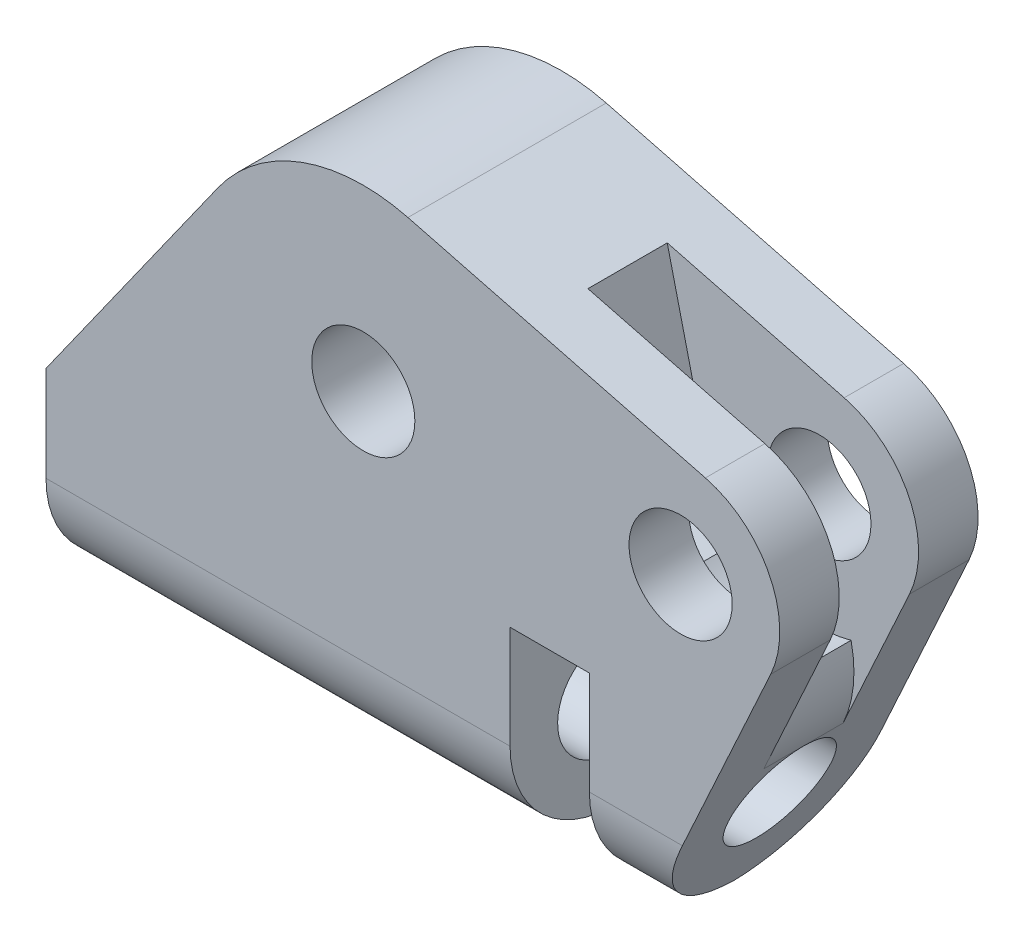
ISO-10303-21;
HEADER;
FILE_DESCRIPTION(('STEP AP214'),'2;1');
FILE_NAME('part.step','',(''),(''),'','','');
FILE_SCHEMA(('AUTOMOTIVE_DESIGN { 1 0 10303 214 1 1 1 1 }'));
ENDSEC;
DATA;
#1=APPLICATION_CONTEXT('core data for automotive mechanical design processes');
#2=APPLICATION_PROTOCOL_DEFINITION('international standard','automotive_design',2000,#1);
#3=PRODUCT_CONTEXT('',#1,'mechanical');
#4=PRODUCT('Part','Part','',(#3));
#5=PRODUCT_RELATED_PRODUCT_CATEGORY('part','',(#4));
#6=PRODUCT_DEFINITION_FORMATION('','',#4);
#7=PRODUCT_DEFINITION_CONTEXT('part definition',#1,'design');
#8=PRODUCT_DEFINITION('design','',#6,#7);
#9=PRODUCT_DEFINITION_SHAPE('','',#8);
#10=(LENGTH_UNIT() NAMED_UNIT(*) SI_UNIT(.MILLI.,.METRE.));
#11=(NAMED_UNIT(*) PLANE_ANGLE_UNIT() SI_UNIT($,.RADIAN.));
#12=(NAMED_UNIT(*) SI_UNIT($,.STERADIAN.) SOLID_ANGLE_UNIT());
#13=UNCERTAINTY_MEASURE_WITH_UNIT(LENGTH_MEASURE(1.E-05),#10,'distance_accuracy_value','');
#14=(GEOMETRIC_REPRESENTATION_CONTEXT(3) GLOBAL_UNCERTAINTY_ASSIGNED_CONTEXT((#13)) GLOBAL_UNIT_ASSIGNED_CONTEXT((#10,
#11,#12)) REPRESENTATION_CONTEXT('',''));
#15=CARTESIAN_POINT('',(0.,0.,0.));
#16=DIRECTION('',(0.,0.,1.));
#17=DIRECTION('',(1.,0.,0.));
#18=AXIS2_PLACEMENT_3D('',#15,#16,#17);
#19=CARTESIAN_POINT('',(474.949704240036,-853.401384058362,-5.));
#20=DIRECTION('',(0.,0.,1.));
#21=DIRECTION('',(1.,0.,0.));
#22=AXIS2_PLACEMENT_3D('',#19,#20,#21);
#23=CYLINDRICAL_SURFACE('',#22,14.5);
#24=DIRECTION('',(0.,0.,1.));
#25=VECTOR('',#24,1.);
#26=CARTESIAN_POINT('',(464.709579504658,-863.667339708173,-5.));
#27=LINE('',#26,#25);
#28=CARTESIAN_POINT('',(464.709579504658,-863.667339708173,5.));
#29=VERTEX_POINT('',#28);
#30=CARTESIAN_POINT('',(464.709579504658,-863.667339708173,-5.));
#31=VERTEX_POINT('',#30);
#32=EDGE_CURVE('E181',#29,#31,#27,.F.);
#33=ORIENTED_EDGE('',*,*,#32,.F.);
#34=CARTESIAN_POINT('',(474.949704240036,-853.401384058362,5.));
#35=DIRECTION('',(0.,0.,1.));
#36=DIRECTION('',(1.,0.,0.));
#37=AXIS2_PLACEMENT_3D('',#34,#35,#36);
#38=CIRCLE('',#37,14.5);
#39=CARTESIAN_POINT('',(478.939828975415,-867.341574322348,5.));
#40=VERTEX_POINT('',#39);
#41=EDGE_CURVE('E211',#29,#40,#38,.T.);
#42=ORIENTED_EDGE('',*,*,#41,.T.);
#43=DIRECTION('',(0.,0.,1.));
#44=VECTOR('',#43,1.);
#45=CARTESIAN_POINT('',(478.939828975415,-867.341574322348,-5.));
#46=LINE('',#45,#44);
#47=CARTESIAN_POINT('',(478.939828975415,-867.341574322348,-5.));
#48=VERTEX_POINT('',#47);
#49=EDGE_CURVE('E202',#48,#40,#46,.T.);
#50=ORIENTED_EDGE('',*,*,#49,.F.);
#51=CARTESIAN_POINT('',(474.949704240036,-853.401384058362,-5.));
#52=DIRECTION('',(0.,0.,1.));
#53=DIRECTION('',(1.,0.,0.));
#54=AXIS2_PLACEMENT_3D('',#51,#52,#53);
#55=CIRCLE('',#54,14.5);
#56=EDGE_CURVE('E214',#31,#48,#55,.T.);
#57=ORIENTED_EDGE('',*,*,#56,.F.);
#58=EDGE_LOOP('',(#33,#42,#50,#57));
#59=FACE_BOUND('',#58,.T.);
#60=ADVANCED_FACE('F32',(#59),#23,.F.);
#61=CARTESIAN_POINT('',(474.949704240036,-883.401384058363,12.5));
#62=DIRECTION('',(-0.909059342886311,0.416666666666664,0.));
#63=DIRECTION('',(-0.416666666666664,-0.909059342886311,0.));
#64=AXIS2_PLACEMENT_3D('',#61,#62,#63);
#65=PLANE('',#64);
#66=CARTESIAN_POINT('',(474.949704240036,-883.401384058363,0.));
#67=DIRECTION('',(-0.909059342886311,0.416666666666664,0.));
#68=DIRECTION('',(-0.416666666666664,-0.909059342886311,0.));
#69=AXIS2_PLACEMENT_3D('',#66,#67,#68);
#70=ELLIPSE('',#69,7.15024827682006,6.50000000000001);
#71=CARTESIAN_POINT('',(471.970434124695,-889.901384058363,0.));
#72=VERTEX_POINT('',#71);
#73=EDGE_CURVE('E272',#72,#72,#70,.T.);
#74=ORIENTED_EDGE('',*,*,#73,.T.);
#75=EDGE_LOOP('',(#74));
#76=FACE_BOUND('',#75,.T.);
#77=DIRECTION('',(0.416666666666664,0.909059342886311,0.));
#78=VECTOR('',#77,1.);
#79=CARTESIAN_POINT('',(474.949704240036,-883.401384058363,-5.));
#80=LINE('',#79,#78);
#81=CARTESIAN_POINT('',(477.940010491954,-876.877306051008,-5.));
#82=VERTEX_POINT('',#81);
#83=CARTESIAN_POINT('',(486.312946026115,-858.609717391696,-5.));
#84=VERTEX_POINT('',#83);
#85=EDGE_CURVE('E47',#82,#84,#80,.T.);
#86=ORIENTED_EDGE('',*,*,#85,.F.);
#87=DIRECTION('',(0.,0.,1.));
#88=VECTOR('',#87,1.);
#89=CARTESIAN_POINT('',(477.940010491954,-876.877306051008,12.5));
#90=LINE('',#89,#88);
#91=CARTESIAN_POINT('',(477.940010491954,-876.877306051008,5.));
#92=VERTEX_POINT('',#91);
#93=EDGE_CURVE('E358',#82,#92,#90,.T.);
#94=ORIENTED_EDGE('',*,*,#93,.T.);
#95=DIRECTION('',(0.416666666666664,0.909059342886311,0.));
#96=VECTOR('',#95,1.);
#97=CARTESIAN_POINT('',(474.949704240036,-883.401384058363,5.));
#98=LINE('',#97,#96);
#99=CARTESIAN_POINT('',(486.312946026115,-858.609717391696,5.));
#100=VERTEX_POINT('',#99);
#101=EDGE_CURVE('E54',#92,#100,#98,.T.);
#102=ORIENTED_EDGE('',*,*,#101,.T.);
#103=DIRECTION('',(0.,0.,-1.));
#104=VECTOR('',#103,1.);
#105=CARTESIAN_POINT('',(486.312946026115,-858.609717391696,12.5));
#106=LINE('',#105,#104);
#107=CARTESIAN_POINT('',(486.312946026115,-858.609717391696,12.5));
#108=VERTEX_POINT('',#107);
#109=EDGE_CURVE('E312',#108,#100,#106,.T.);
#110=ORIENTED_EDGE('',*,*,#109,.F.);
#111=DIRECTION('',(0.416666666666666,0.90905934288631,0.));
#112=VECTOR('',#111,1.);
#113=CARTESIAN_POINT('',(469.22033863361,-895.901384058363,12.5));
#114=LINE('',#113,#112);
#115=CARTESIAN_POINT('',(475.178878864293,-882.901384058363,12.5));
#116=VERTEX_POINT('',#115);
#117=EDGE_CURVE('E287',#116,#108,#114,.T.);
#118=ORIENTED_EDGE('',*,*,#117,.F.);
#119=CARTESIAN_POINT('',(475.178878864293,-882.901384058363,-0.499999999999999));
#120=DIRECTION('',(-0.909059342886311,0.416666666666664,0.));
#121=DIRECTION('',(-0.416666666666664,-0.909059342886311,0.));
#122=AXIS2_PLACEMENT_3D('',#119,#120,#121);
#123=ELLIPSE('',#122,14.3004965536401,13.);
#124=CARTESIAN_POINT('',(469.224747469012,-895.891765115129,-7.18251413206472E-12));
#125=VERTEX_POINT('',#124);
#126=EDGE_CURVE('E331',#116,#125,#123,.F.);
#127=ORIENTED_EDGE('',*,*,#126,.T.);
#128=CARTESIAN_POINT('',(475.178878864293,-882.901384058363,0.499999999999999));
#129=DIRECTION('',(-0.909059342886311,0.416666666666664,0.));
#130=DIRECTION('',(0.416666666666664,0.909059342886311,0.));
#131=AXIS2_PLACEMENT_3D('',#128,#129,#130);
#132=ELLIPSE('',#131,14.3004965536401,13.);
#133=CARTESIAN_POINT('',(475.178878864293,-882.901384058363,-12.5));
#134=VERTEX_POINT('',#133);
#135=EDGE_CURVE('E337',#125,#134,#132,.F.);
#136=ORIENTED_EDGE('',*,*,#135,.T.);
#137=DIRECTION('',(0.416666666666664,0.909059342886311,0.));
#138=VECTOR('',#137,1.);
#139=CARTESIAN_POINT('',(474.949704240036,-883.401384058363,-12.5));
#140=LINE('',#139,#138);
#141=CARTESIAN_POINT('',(486.312946026115,-858.609717391696,-12.5));
#142=VERTEX_POINT('',#141);
#143=EDGE_CURVE('E298',#134,#142,#140,.T.);
#144=ORIENTED_EDGE('',*,*,#143,.T.);
#145=EDGE_CURVE('E311',#84,#142,#106,.T.);
#146=ORIENTED_EDGE('',*,*,#145,.F.);
#147=EDGE_LOOP('',(#86,#94,#102,#110,#118,#127,#136,#144,#146));
#148=FACE_BOUND('',#147,.T.);
#149=ADVANCED_FACE('F364',(#76,#148),#65,.F.);
#150=CARTESIAN_POINT('',(474.949704240036,-853.401384058362,12.5));
#151=DIRECTION('',(0.,0.,-1.));
#152=DIRECTION('',(-1.,0.,0.));
#153=AXIS2_PLACEMENT_3D('',#150,#151,#152);
#154=CYLINDRICAL_SURFACE('',#153,12.5);
#155=CARTESIAN_POINT('',(474.949704240036,-853.401384058362,-5.));
#156=DIRECTION('',(0.,0.,1.));
#157=DIRECTION('',(1.,0.,0.));
#158=AXIS2_PLACEMENT_3D('',#155,#156,#157);
#159=CIRCLE('',#158,12.5);
#160=CARTESIAN_POINT('',(478.074704240036,-841.298311101464,-5.));
#161=VERTEX_POINT('',#160);
#162=EDGE_CURVE('E234',#84,#161,#159,.T.);
#163=ORIENTED_EDGE('',*,*,#162,.F.);
#164=ORIENTED_EDGE('',*,*,#145,.T.);
#165=CARTESIAN_POINT('',(474.949704240036,-853.401384058362,-12.5));
#166=DIRECTION('',(0.,0.,1.));
#167=DIRECTION('',(1.,0.,0.));
#168=AXIS2_PLACEMENT_3D('',#165,#166,#167);
#169=CIRCLE('',#168,12.5);
#170=CARTESIAN_POINT('',(478.074704240036,-841.298311101464,-12.5));
#171=VERTEX_POINT('',#170);
#172=EDGE_CURVE('E301',#142,#171,#169,.T.);
#173=ORIENTED_EDGE('',*,*,#172,.T.);
#174=DIRECTION('',(0.,0.,-1.));
#175=VECTOR('',#174,1.);
#176=CARTESIAN_POINT('',(478.074704240036,-841.298311101464,12.5));
#177=LINE('',#176,#175);
#178=EDGE_CURVE('E307',#161,#171,#177,.T.);
#179=ORIENTED_EDGE('',*,*,#178,.F.);
#180=EDGE_LOOP('',(#163,#164,#173,#179));
#181=FACE_BOUND('',#180,.T.);
#182=ADVANCED_FACE('F399',(#181),#154,.T.);
#183=CARTESIAN_POINT('',(440.574704240036,-831.615852735946,12.5));
#184=DIRECTION('',(-0.249999999999999,-0.968245836551854,0.));
#185=DIRECTION('',(0.968245836551854,-0.249999999999999,0.));
#186=AXIS2_PLACEMENT_3D('',#183,#184,#185);
#187=PLANE('',#186);
#188=DIRECTION('',(-0.968245836551853,0.250000000000004,0.));
#189=VECTOR('',#188,1.);
#190=CARTESIAN_POINT('',(470.959579504657,-839.461193794377,-5.));
#191=LINE('',#190,#189);
#192=CARTESIAN_POINT('',(455.767141872347,-835.538523265161,-5.));
#193=VERTEX_POINT('',#192);
#194=EDGE_CURVE('E216',#161,#193,#191,.T.);
#195=ORIENTED_EDGE('',*,*,#194,.F.);
#196=ORIENTED_EDGE('',*,*,#178,.T.);
#197=DIRECTION('',(-0.968245836551854,0.249999999999999,0.));
#198=VECTOR('',#197,1.);
#199=CARTESIAN_POINT('',(440.574704240036,-831.615852735946,-12.5));
#200=LINE('',#199,#198);
#201=CARTESIAN_POINT('',(440.574704240036,-831.615852735946,-12.5));
#202=VERTEX_POINT('',#201);
#203=EDGE_CURVE('E284',#171,#202,#200,.T.);
#204=ORIENTED_EDGE('',*,*,#203,.T.);
#205=DIRECTION('',(0.,0.,-1.));
#206=VECTOR('',#205,1.);
#207=CARTESIAN_POINT('',(440.574704240036,-831.615852735946,12.5));
#208=LINE('',#207,#206);
#209=CARTESIAN_POINT('',(440.574704240036,-831.615852735946,12.5));
#210=VERTEX_POINT('',#209);
#211=EDGE_CURVE('E293',#210,#202,#208,.T.);
#212=ORIENTED_EDGE('',*,*,#211,.F.);
#213=DIRECTION('',(-0.968245836551854,0.249999999999999,0.));
#214=VECTOR('',#213,1.);
#215=CARTESIAN_POINT('',(440.574704240036,-831.615852735946,12.5));
#216=LINE('',#215,#214);
#217=CARTESIAN_POINT('',(478.074704240036,-841.298311101464,12.5));
#218=VERTEX_POINT('',#217);
#219=EDGE_CURVE('E291',#218,#210,#216,.T.);
#220=ORIENTED_EDGE('',*,*,#219,.F.);
#221=CARTESIAN_POINT('',(478.074704240036,-841.298311101464,5.));
#222=VERTEX_POINT('',#221);
#223=EDGE_CURVE('E308',#218,#222,#177,.T.);
#224=ORIENTED_EDGE('',*,*,#223,.T.);
#225=DIRECTION('',(-0.968245836551854,0.249999999999999,0.));
#226=VECTOR('',#225,1.);
#227=CARTESIAN_POINT('',(440.574704240036,-831.615852735946,5.));
#228=LINE('',#227,#226);
#229=CARTESIAN_POINT('',(455.767141872347,-835.538523265161,5.));
#230=VERTEX_POINT('',#229);
#231=EDGE_CURVE('E227',#222,#230,#228,.T.);
#232=ORIENTED_EDGE('',*,*,#231,.T.);
#233=DIRECTION('',(0.,0.,1.));
#234=VECTOR('',#233,1.);
#235=CARTESIAN_POINT('',(455.767141872347,-835.538523265161,-5.));
#236=LINE('',#235,#234);
#237=EDGE_CURVE('E220',#193,#230,#236,.T.);
#238=ORIENTED_EDGE('',*,*,#237,.F.);
#239=EDGE_LOOP('',(#195,#196,#204,#212,#220,#224,#232,#238));
#240=FACE_BOUND('',#239,.T.);
#241=ADVANCED_FACE('F403',(#240),#187,.F.);
#242=CARTESIAN_POINT('',(474.949704240036,-853.401384058362,12.5));
#243=DIRECTION('',(0.,0.,-1.));
#244=DIRECTION('',(-1.,0.,0.));
#245=AXIS2_PLACEMENT_3D('',#242,#243,#244);
#246=CYLINDRICAL_SURFACE('',#245,6.50000000000002);
#247=CARTESIAN_POINT('',(474.949704240036,-853.401384058362,-12.5));
#248=DIRECTION('',(0.,0.,1.));
#249=DIRECTION('',(1.,0.,0.));
#250=AXIS2_PLACEMENT_3D('',#247,#248,#249);
#251=CIRCLE('',#250,6.50000000000002);
#252=CARTESIAN_POINT('',(481.449704240036,-853.401384058362,-12.5));
#253=VERTEX_POINT('',#252);
#254=EDGE_CURVE('E278',#253,#253,#251,.T.);
#255=ORIENTED_EDGE('',*,*,#254,.F.);
#256=EDGE_LOOP('',(#255));
#257=FACE_BOUND('',#256,.T.);
#258=CARTESIAN_POINT('',(474.949704240036,-853.401384058362,-5.));
#259=DIRECTION('',(0.,0.,1.));
#260=DIRECTION('',(1.,0.,0.));
#261=AXIS2_PLACEMENT_3D('',#258,#259,#260);
#262=CIRCLE('',#261,6.50000000000002);
#263=CARTESIAN_POINT('',(481.449704240036,-853.401384058362,-5.));
#264=VERTEX_POINT('',#263);
#265=EDGE_CURVE('E208',#264,#264,#262,.T.);
#266=ORIENTED_EDGE('',*,*,#265,.T.);
#267=EDGE_LOOP('',(#266));
#268=FACE_BOUND('',#267,.T.);
#269=ADVANCED_FACE('F442',(#257,#268),#246,.F.);
#270=CARTESIAN_POINT('',(487.449704240036,-883.401384058363,0.));
#271=DIRECTION('',(-1.,0.,0.));
#272=DIRECTION('',(0.,-1.,0.));
#273=AXIS2_PLACEMENT_3D('',#270,#271,#272);
#274=CYLINDRICAL_SURFACE('',#273,6.50000000000001);
#275=CARTESIAN_POINT('',(453.449704240036,-883.401384058363,0.));
#276=DIRECTION('',(-1.,0.,0.));
#277=DIRECTION('',(0.,0.,1.));
#278=AXIS2_PLACEMENT_3D('',#275,#276,#277);
#279=CIRCLE('',#278,6.50000000000001);
#280=CARTESIAN_POINT('',(453.449704240036,-889.901384058363,0.));
#281=VERTEX_POINT('',#280);
#282=EDGE_CURVE('E265',#281,#281,#279,.F.);
#283=CARTESIAN_POINT('',(394.949704240037,-883.401384058363,0.));
#284=DIRECTION('',(-1.,0.,0.));
#285=DIRECTION('',(0.,-1.,0.));
#286=AXIS2_PLACEMENT_3D('',#283,#284,#285);
#287=CIRCLE('',#286,6.50000000000001);
#288=CARTESIAN_POINT('',(394.949704240037,-889.901384058363,0.));
#289=VERTEX_POINT('',#288);
#290=EDGE_CURVE('E269',#289,#289,#287,.T.);
#291=CARTESIAN_POINT('',(453.449704240036,-889.901384058363,0.));
#292=CARTESIAN_POINT('',(452.840329240036,-889.901384058363,0.));
#293=CARTESIAN_POINT('',(452.230954240036,-889.901384058363,0.));
#294=CARTESIAN_POINT('',(451.012204240036,-889.901384058363,0.));
#295=CARTESIAN_POINT('',(450.402829240036,-889.901384058363,0.));
#296=CARTESIAN_POINT('',(449.184079240036,-889.901384058363,0.));
#297=CARTESIAN_POINT('',(448.574704240036,-889.901384058363,0.));
#298=CARTESIAN_POINT('',(447.355954240036,-889.901384058363,0.));
#299=CARTESIAN_POINT('',(446.746579240036,-889.901384058363,0.));
#300=CARTESIAN_POINT('',(445.527829240036,-889.901384058363,0.));
#301=CARTESIAN_POINT('',(444.918454240036,-889.901384058363,0.));
#302=CARTESIAN_POINT('',(443.699704240036,-889.901384058363,0.));
#303=CARTESIAN_POINT('',(443.090329240036,-889.901384058363,0.));
#304=CARTESIAN_POINT('',(441.871579240036,-889.901384058363,0.));
#305=CARTESIAN_POINT('',(441.262204240036,-889.901384058363,0.));
#306=CARTESIAN_POINT('',(440.043454240036,-889.901384058363,0.));
#307=CARTESIAN_POINT('',(439.434079240036,-889.901384058363,0.));
#308=CARTESIAN_POINT('',(438.215329240036,-889.901384058363,0.));
#309=CARTESIAN_POINT('',(437.605954240036,-889.901384058363,0.));
#310=CARTESIAN_POINT('',(436.387204240036,-889.901384058363,0.));
#311=CARTESIAN_POINT('',(435.777829240036,-889.901384058363,0.));
#312=CARTESIAN_POINT('',(434.559079240036,-889.901384058363,0.));
#313=CARTESIAN_POINT('',(433.949704240036,-889.901384058363,0.));
#314=CARTESIAN_POINT('',(432.730954240036,-889.901384058363,0.));
#315=CARTESIAN_POINT('',(432.121579240036,-889.901384058363,0.));
#316=CARTESIAN_POINT('',(430.902829240036,-889.901384058363,0.));
#317=CARTESIAN_POINT('',(430.293454240036,-889.901384058363,0.));
#318=CARTESIAN_POINT('',(429.074704240036,-889.901384058363,0.));
#319=CARTESIAN_POINT('',(428.465329240036,-889.901384058363,0.));
#320=CARTESIAN_POINT('',(427.246579240036,-889.901384058363,0.));
#321=CARTESIAN_POINT('',(426.637204240036,-889.901384058363,0.));
#322=CARTESIAN_POINT('',(425.418454240036,-889.901384058363,0.));
#323=CARTESIAN_POINT('',(424.809079240036,-889.901384058363,0.));
#324=CARTESIAN_POINT('',(423.590329240036,-889.901384058363,0.));
#325=CARTESIAN_POINT('',(422.980954240036,-889.901384058363,0.));
#326=CARTESIAN_POINT('',(421.762204240036,-889.901384058363,0.));
#327=CARTESIAN_POINT('',(421.152829240036,-889.901384058363,0.));
#328=CARTESIAN_POINT('',(419.934079240036,-889.901384058363,0.));
#329=CARTESIAN_POINT('',(419.324704240036,-889.901384058363,0.));
#330=CARTESIAN_POINT('',(418.105954240036,-889.901384058363,0.));
#331=CARTESIAN_POINT('',(417.496579240036,-889.901384058363,0.));
#332=CARTESIAN_POINT('',(416.277829240036,-889.901384058363,0.));
#333=CARTESIAN_POINT('',(415.668454240036,-889.901384058363,0.));
#334=CARTESIAN_POINT('',(414.449704240036,-889.901384058363,0.));
#335=CARTESIAN_POINT('',(413.840329240036,-889.901384058363,0.));
#336=CARTESIAN_POINT('',(412.621579240036,-889.901384058363,0.));
#337=CARTESIAN_POINT('',(412.012204240036,-889.901384058363,0.));
#338=CARTESIAN_POINT('',(410.793454240036,-889.901384058363,0.));
#339=CARTESIAN_POINT('',(410.184079240036,-889.901384058363,0.));
#340=CARTESIAN_POINT('',(408.965329240036,-889.901384058363,0.));
#341=CARTESIAN_POINT('',(408.355954240036,-889.901384058363,0.));
#342=CARTESIAN_POINT('',(407.137204240036,-889.901384058363,0.));
#343=CARTESIAN_POINT('',(406.527829240037,-889.901384058363,0.));
#344=CARTESIAN_POINT('',(405.309079240037,-889.901384058363,0.));
#345=CARTESIAN_POINT('',(404.699704240037,-889.901384058363,0.));
#346=CARTESIAN_POINT('',(403.480954240037,-889.901384058363,0.));
#347=CARTESIAN_POINT('',(402.871579240037,-889.901384058363,0.));
#348=CARTESIAN_POINT('',(401.652829240036,-889.901384058363,0.));
#349=CARTESIAN_POINT('',(401.043454240037,-889.901384058363,0.));
#350=CARTESIAN_POINT('',(399.824704240037,-889.901384058363,0.));
#351=CARTESIAN_POINT('',(399.215329240037,-889.901384058363,0.));
#352=CARTESIAN_POINT('',(397.996579240037,-889.901384058363,0.));
#353=CARTESIAN_POINT('',(397.387204240037,-889.901384058363,0.));
#354=CARTESIAN_POINT('',(396.168454240037,-889.901384058363,0.));
#355=CARTESIAN_POINT('',(395.559079240037,-889.901384058363,0.));
#356=CARTESIAN_POINT('',(394.949704240037,-889.901384058363,0.));
#357=B_SPLINE_CURVE_WITH_KNOTS('',3,(#291,#292,#293,#294,#295,#296,#297,#298,#299,#300,#301,
#302,#303,#304,#305,#306,#307,#308,#309,#310,#311,#312,#313,#314,#315,#316,#317,#318,#319,#320,
#321,#322,#323,#324,#325,#326,#327,#328,#329,#330,#331,#332,#333,#334,#335,#336,#337,#338,#339,
#340,#341,#342,#343,#344,#345,#346,#347,#348,#349,#350,#351,#352,#353,#354,#355,#356),
.UNSPECIFIED.,.F.,.F.,(4,2,2,2,2,2,2,2,2,2,2,2,2,2,2,2,2,2,2,2,2,2,2,2,2,2,2,2,2,2,2,2,4),(0.,
1.82812500000001,3.65624999999997,5.48437499999999,7.3125,9.14062499999996,10.96875,
12.7968749999999,14.6249999999999,16.4531249999999,18.2812499999999,20.1093749999999,
21.9374999999999,23.7656249999999,25.5937499999999,27.4218749999999,29.2499999999998,
31.0781249999998,32.9062499999998,34.7343749999998,36.5624999999998,38.3906249999998,
40.2187499999998,42.0468749999998,43.8749999999998,45.7031249999997,47.5312499999997,
49.3593749999997,51.1874999999997,53.0156249999997,54.8437499999997,56.6718749999997,
58.4999999999997),.UNSPECIFIED.);
#358=EDGE_CURVE('BSEAM438',#281,#289,#357,.T.);
#359=ORIENTED_EDGE('',*,*,#282,.T.);
#360=ORIENTED_EDGE('',*,*,#290,.T.);
#361=ORIENTED_EDGE('',*,*,#358,.T.);
#362=ORIENTED_EDGE('',*,*,#358,.F.);
#363=EDGE_LOOP('',(#359,#361,#360,#362));
#364=FACE_BOUND('',#363,.T.);
#365=ADVANCED_FACE('F438',(#364),#274,.F.);
#366=CARTESIAN_POINT('',(434.949704240036,-882.901384058363,-0.499999999999999));
#367=DIRECTION('',(-1.,0.,0.));
#368=DIRECTION('',(0.,0.,1.));
#369=AXIS2_PLACEMENT_3D('',#366,#367,#368);
#370=CYLINDRICAL_SURFACE('',#369,13.);
#371=CARTESIAN_POINT('',(453.449704240036,-882.901384058363,-0.499999999999999));
#372=DIRECTION('',(-1.,0.,0.));
#373=DIRECTION('',(0.,0.,1.));
#374=AXIS2_PLACEMENT_3D('',#371,#372,#373);
#375=CIRCLE('',#374,13.);
#376=CARTESIAN_POINT('',(453.449704240036,-882.901384058363,12.5));
#377=VERTEX_POINT('',#376);
#378=CARTESIAN_POINT('',(453.449704240036,-895.891765115129,-1.25420507313123E-12));
#379=VERTEX_POINT('',#378);
#380=EDGE_CURVE('E263',#377,#379,#375,.F.);
#381=ORIENTED_EDGE('',*,*,#380,.F.);
#382=DIRECTION('',(1.,0.,0.));
#383=VECTOR('',#382,1.);
#384=CARTESIAN_POINT('',(469.22033863361,-882.901384058363,12.5));
#385=LINE('',#384,#383);
#386=CARTESIAN_POINT('',(394.949704240036,-882.901384058363,12.5));
#387=VERTEX_POINT('',#386);
#388=EDGE_CURVE('E349',#387,#377,#385,.T.);
#389=ORIENTED_EDGE('',*,*,#388,.F.);
#390=CARTESIAN_POINT('',(394.949704240036,-882.901384058363,-0.499999999999999));
#391=DIRECTION('',(1.,0.,0.));
#392=DIRECTION('',(0.,0.,-1.));
#393=AXIS2_PLACEMENT_3D('',#390,#391,#392);
#394=CIRCLE('',#393,13.);
#395=CARTESIAN_POINT('',(394.949704240036,-895.891765115129,0.));
#396=VERTEX_POINT('',#395);
#397=EDGE_CURVE('E343',#396,#387,#394,.F.);
#398=ORIENTED_EDGE('',*,*,#397,.F.);
#399=DIRECTION('',(-1.,0.,0.));
#400=VECTOR('',#399,1.);
#401=CARTESIAN_POINT('',(435.304979076038,-895.891765115129,0.));
#402=LINE('',#401,#400);
#403=EDGE_CURVE('E268',#379,#396,#402,.T.);
#404=ORIENTED_EDGE('',*,*,#403,.F.);
#405=EDGE_LOOP('',(#381,#389,#398,#404));
#406=FACE_BOUND('',#405,.T.);
#407=ADVANCED_FACE('F470',(#406),#370,.T.);
#408=CARTESIAN_POINT('',(394.949704240036,-882.901384058363,0.499999999999999));
#409=DIRECTION('',(1.,0.,0.));
#410=DIRECTION('',(0.,0.,-1.));
#411=AXIS2_PLACEMENT_3D('',#408,#409,#410);
#412=CYLINDRICAL_SURFACE('',#411,13.);
#413=CARTESIAN_POINT('',(453.449704240036,-882.901384058363,0.499999999999999));
#414=DIRECTION('',(-1.,0.,0.));
#415=DIRECTION('',(0.,0.,1.));
#416=AXIS2_PLACEMENT_3D('',#413,#414,#415);
#417=CIRCLE('',#416,13.);
#418=CARTESIAN_POINT('',(453.449704240036,-882.901384058363,-12.5));
#419=VERTEX_POINT('',#418);
#420=EDGE_CURVE('E356',#379,#419,#417,.F.);
#421=ORIENTED_EDGE('',*,*,#420,.F.);
#422=ORIENTED_EDGE('',*,*,#403,.T.);
#423=CARTESIAN_POINT('',(394.949704240036,-882.901384058363,0.499999999999999));
#424=DIRECTION('',(1.,0.,0.));
#425=DIRECTION('',(0.,0.,-1.));
#426=AXIS2_PLACEMENT_3D('',#423,#424,#425);
#427=CIRCLE('',#426,13.);
#428=CARTESIAN_POINT('',(394.949704240036,-882.901384058363,-12.5));
#429=VERTEX_POINT('',#428);
#430=EDGE_CURVE('E345',#429,#396,#427,.F.);
#431=ORIENTED_EDGE('',*,*,#430,.F.);
#432=DIRECTION('',(1.,0.,0.));
#433=VECTOR('',#432,1.);
#434=CARTESIAN_POINT('',(434.949704240036,-882.901384058363,-12.5));
#435=LINE('',#434,#433);
#436=EDGE_CURVE('E339',#419,#429,#435,.F.);
#437=ORIENTED_EDGE('',*,*,#436,.F.);
#438=EDGE_LOOP('',(#421,#422,#431,#437));
#439=FACE_BOUND('',#438,.T.);
#440=ADVANCED_FACE('F466',(#439),#412,.T.);
#441=CARTESIAN_POINT('',(434.949704240036,-853.401384058363,12.5));
#442=DIRECTION('',(0.,0.,-1.));
#443=DIRECTION('',(-1.,0.,0.));
#444=AXIS2_PLACEMENT_3D('',#441,#442,#443);
#445=CYLINDRICAL_SURFACE('',#444,22.5000000000001);
#446=DIRECTION('',(0.,0.,-1.));
#447=VECTOR('',#446,1.);
#448=CARTESIAN_POINT('',(416.598084064077,-840.383395084741,12.5));
#449=LINE('',#448,#447);
#450=CARTESIAN_POINT('',(416.598084064077,-840.383395084741,12.5));
#451=VERTEX_POINT('',#450);
#452=CARTESIAN_POINT('',(416.598084064077,-840.383395084741,-12.5));
#453=VERTEX_POINT('',#452);
#454=EDGE_CURVE('E318',#451,#453,#449,.T.);
#455=ORIENTED_EDGE('',*,*,#454,.F.);
#456=CARTESIAN_POINT('',(434.949704240036,-853.401384058363,12.5));
#457=DIRECTION('',(0.,0.,1.));
#458=DIRECTION('',(1.,0.,0.));
#459=AXIS2_PLACEMENT_3D('',#456,#457,#458);
#460=CIRCLE('',#459,22.5000000000001);
#461=EDGE_CURVE('E328',#210,#451,#460,.T.);
#462=ORIENTED_EDGE('',*,*,#461,.F.);
#463=ORIENTED_EDGE('',*,*,#211,.T.);
#464=CARTESIAN_POINT('',(434.949704240036,-853.401384058363,-12.5));
#465=DIRECTION('',(0.,0.,1.));
#466=DIRECTION('',(1.,0.,0.));
#467=AXIS2_PLACEMENT_3D('',#464,#465,#466);
#468=CIRCLE('',#467,22.5000000000001);
#469=EDGE_CURVE('E325',#202,#453,#468,.T.);
#470=ORIENTED_EDGE('',*,*,#469,.T.);
#471=EDGE_LOOP('',(#455,#462,#463,#470));
#472=FACE_BOUND('',#471,.T.);
#473=ADVANCED_FACE('F461',(#472),#445,.T.);
#474=CARTESIAN_POINT('',(434.949704240036,-853.401384058363,12.5));
#475=DIRECTION('',(0.,0.,1.));
#476=DIRECTION('',(1.,0.,0.));
#477=AXIS2_PLACEMENT_3D('',#474,#475,#476);
#478=PLANE('',#477);
#479=DIRECTION('',(0.,-1.,0.));
#480=VECTOR('',#479,1.);
#481=CARTESIAN_POINT('',(453.449704240036,-895.891765115129,12.5));
#482=LINE('',#481,#480);
#483=CARTESIAN_POINT('',(453.449704240036,-869.911003001596,12.5));
#484=VERTEX_POINT('',#483);
#485=EDGE_CURVE('E237',#484,#377,#482,.T.);
#486=ORIENTED_EDGE('',*,*,#485,.F.);
#487=DIRECTION('',(-1.,0.,0.));
#488=VECTOR('',#487,1.);
#489=CARTESIAN_POINT('',(453.449704240036,-869.911003001596,12.5));
#490=LINE('',#489,#488);
#491=CARTESIAN_POINT('',(463.449704240036,-869.911003001596,12.5));
#492=VERTEX_POINT('',#491);
#493=EDGE_CURVE('E242',#492,#484,#490,.T.);
#494=ORIENTED_EDGE('',*,*,#493,.F.);
#495=DIRECTION('',(0.,1.,0.));
#496=VECTOR('',#495,1.);
#497=CARTESIAN_POINT('',(463.449704240036,-869.911003001596,12.5));
#498=LINE('',#497,#496);
#499=CARTESIAN_POINT('',(463.449704240036,-882.901384058363,12.5));
#500=VERTEX_POINT('',#499);
#501=EDGE_CURVE('E250',#500,#492,#498,.T.);
#502=ORIENTED_EDGE('',*,*,#501,.F.);
#503=EDGE_CURVE('E348',#500,#116,#385,.T.);
#504=ORIENTED_EDGE('',*,*,#503,.T.);
#505=ORIENTED_EDGE('',*,*,#117,.T.);
#506=CARTESIAN_POINT('',(474.949704240036,-853.401384058362,12.5));
#507=DIRECTION('',(0.,0.,1.));
#508=DIRECTION('',(1.,0.,0.));
#509=AXIS2_PLACEMENT_3D('',#506,#507,#508);
#510=CIRCLE('',#509,12.5);
#511=EDGE_CURVE('E289',#108,#218,#510,.T.);
#512=ORIENTED_EDGE('',*,*,#511,.T.);
#513=ORIENTED_EDGE('',*,*,#219,.T.);
#514=ORIENTED_EDGE('',*,*,#461,.T.);
#515=DIRECTION('',(-0.578577287716494,-0.815627563375972,0.));
#516=VECTOR('',#515,1.);
#517=CARTESIAN_POINT('',(394.949704240036,-870.901384058363,12.5));
#518=LINE('',#517,#516);
#519=CARTESIAN_POINT('',(394.949704240036,-870.901384058363,12.5));
#520=VERTEX_POINT('',#519);
#521=EDGE_CURVE('E281',#451,#520,#518,.T.);
#522=ORIENTED_EDGE('',*,*,#521,.T.);
#523=DIRECTION('',(0.,-1.,0.));
#524=VECTOR('',#523,1.);
#525=CARTESIAN_POINT('',(394.949704240036,-870.901384058363,12.5));
#526=LINE('',#525,#524);
#527=EDGE_CURVE('E283',#520,#387,#526,.T.);
#528=ORIENTED_EDGE('',*,*,#527,.T.);
#529=ORIENTED_EDGE('',*,*,#388,.T.);
#530=EDGE_LOOP('',(#486,#494,#502,#504,#505,#512,#513,#514,#522,#528,#529));
#531=FACE_BOUND('',#530,.T.);
#532=CARTESIAN_POINT('',(434.949704240036,-853.401384058363,12.5));
#533=DIRECTION('',(0.,0.,1.));
#534=DIRECTION('',(1.,0.,0.));
#535=AXIS2_PLACEMENT_3D('',#532,#533,#534);
#536=CIRCLE('',#535,6.50000000000007);
#537=CARTESIAN_POINT('',(441.449704240036,-853.401384058363,12.5));
#538=VERTEX_POINT('',#537);
#539=EDGE_CURVE('E322',#538,#538,#536,.T.);
#540=ORIENTED_EDGE('',*,*,#539,.F.);
#541=EDGE_LOOP('',(#540));
#542=FACE_BOUND('',#541,.T.);
#543=CARTESIAN_POINT('',(474.949704240036,-853.401384058362,12.5));
#544=DIRECTION('',(0.,0.,1.));
#545=DIRECTION('',(1.,0.,0.));
#546=AXIS2_PLACEMENT_3D('',#543,#544,#545);
#547=CIRCLE('',#546,6.50000000000002);
#548=CARTESIAN_POINT('',(481.449704240036,-853.401384058362,12.5));
#549=VERTEX_POINT('',#548);
#550=EDGE_CURVE('E274',#549,#549,#547,.T.);
#551=ORIENTED_EDGE('',*,*,#550,.F.);
#552=EDGE_LOOP('',(#551));
#553=FACE_BOUND('',#552,.T.);
#554=ADVANCED_FACE('F375',(#531,#542,#553),#478,.T.);
#555=CARTESIAN_POINT('',(434.949704240036,-853.401384058363,-12.5));
#556=DIRECTION('',(0.,0.,1.));
#557=DIRECTION('',(1.,0.,0.));
#558=AXIS2_PLACEMENT_3D('',#555,#556,#557);
#559=PLANE('',#558);
#560=DIRECTION('',(-1.,0.,0.));
#561=VECTOR('',#560,1.);
#562=CARTESIAN_POINT('',(453.449704240036,-869.911003001596,-12.5));
#563=LINE('',#562,#561);
#564=CARTESIAN_POINT('',(463.449704240036,-869.911003001596,-12.5));
#565=VERTEX_POINT('',#564);
#566=CARTESIAN_POINT('',(453.449704240036,-869.911003001596,-12.5));
#567=VERTEX_POINT('',#566);
#568=EDGE_CURVE('E245',#565,#567,#563,.T.);
#569=ORIENTED_EDGE('',*,*,#568,.T.);
#570=DIRECTION('',(0.,-1.,0.));
#571=VECTOR('',#570,1.);
#572=CARTESIAN_POINT('',(453.449704240036,-895.891765115129,-12.5));
#573=LINE('',#572,#571);
#574=EDGE_CURVE('E238',#567,#419,#573,.T.);
#575=ORIENTED_EDGE('',*,*,#574,.T.);
#576=ORIENTED_EDGE('',*,*,#436,.T.);
#577=DIRECTION('',(0.,-1.,0.));
#578=VECTOR('',#577,1.);
#579=CARTESIAN_POINT('',(394.949704240036,-870.901384058363,-12.5));
#580=LINE('',#579,#578);
#581=CARTESIAN_POINT('',(394.949704240036,-870.901384058363,-12.5));
#582=VERTEX_POINT('',#581);
#583=EDGE_CURVE('E295',#582,#429,#580,.T.);
#584=ORIENTED_EDGE('',*,*,#583,.F.);
#585=DIRECTION('',(-0.578577287716494,-0.815627563375972,0.));
#586=VECTOR('',#585,1.);
#587=CARTESIAN_POINT('',(394.949704240036,-870.901384058363,-12.5));
#588=LINE('',#587,#586);
#589=EDGE_CURVE('E277',#453,#582,#588,.T.);
#590=ORIENTED_EDGE('',*,*,#589,.F.);
#591=ORIENTED_EDGE('',*,*,#469,.F.);
#592=ORIENTED_EDGE('',*,*,#203,.F.);
#593=ORIENTED_EDGE('',*,*,#172,.F.);
#594=ORIENTED_EDGE('',*,*,#143,.F.);
#595=CARTESIAN_POINT('',(463.449704240036,-882.901384058363,-12.5));
#596=VERTEX_POINT('',#595);
#597=EDGE_CURVE('E340',#134,#596,#435,.F.);
#598=ORIENTED_EDGE('',*,*,#597,.T.);
#599=DIRECTION('',(0.,1.,0.));
#600=VECTOR('',#599,1.);
#601=CARTESIAN_POINT('',(463.449704240036,-869.911003001596,-12.5));
#602=LINE('',#601,#600);
#603=EDGE_CURVE('E241',#596,#565,#602,.T.);
#604=ORIENTED_EDGE('',*,*,#603,.T.);
#605=EDGE_LOOP('',(#569,#575,#576,#584,#590,#591,#592,#593,#594,#598,#604));
#606=FACE_BOUND('',#605,.T.);
#607=CARTESIAN_POINT('',(434.949704240036,-853.401384058363,-12.5));
#608=DIRECTION('',(0.,0.,1.));
#609=DIRECTION('',(1.,0.,0.));
#610=AXIS2_PLACEMENT_3D('',#607,#608,#609);
#611=CIRCLE('',#610,6.50000000000007);
#612=CARTESIAN_POINT('',(441.449704240036,-853.401384058363,-12.5));
#613=VERTEX_POINT('',#612);
#614=EDGE_CURVE('E321',#613,#613,#611,.T.);
#615=ORIENTED_EDGE('',*,*,#614,.T.);
#616=EDGE_LOOP('',(#615));
#617=FACE_BOUND('',#616,.T.);
#618=ORIENTED_EDGE('',*,*,#254,.T.);
#619=EDGE_LOOP('',(#618));
#620=FACE_BOUND('',#619,.T.);
#621=ADVANCED_FACE('F393',(#606,#617,#620),#559,.F.);
#622=CARTESIAN_POINT('',(434.949704240036,-853.401384058363,12.5));
#623=DIRECTION('',(0.,0.,-1.));
#624=DIRECTION('',(-1.,0.,0.));
#625=AXIS2_PLACEMENT_3D('',#622,#623,#624);
#626=CYLINDRICAL_SURFACE('',#625,6.50000000000007);
#627=ORIENTED_EDGE('',*,*,#539,.T.);
#628=EDGE_LOOP('',(#627));
#629=FACE_BOUND('',#628,.T.);
#630=ORIENTED_EDGE('',*,*,#614,.F.);
#631=EDGE_LOOP('',(#630));
#632=FACE_BOUND('',#631,.T.);
#633=ADVANCED_FACE('F454',(#629,#632),#626,.F.);
#634=CARTESIAN_POINT('',(394.949704240036,-870.901384058363,12.5));
#635=DIRECTION('',(0.815627563375972,-0.578577287716494,0.));
#636=DIRECTION('',(0.578577287716494,0.815627563375972,0.));
#637=AXIS2_PLACEMENT_3D('',#634,#635,#636);
#638=PLANE('',#637);
#639=ORIENTED_EDGE('',*,*,#589,.T.);
#640=DIRECTION('',(0.,0.,-1.));
#641=VECTOR('',#640,1.);
#642=CARTESIAN_POINT('',(394.949704240036,-870.901384058363,12.5));
#643=LINE('',#642,#641);
#644=EDGE_CURVE('E315',#520,#582,#643,.T.);
#645=ORIENTED_EDGE('',*,*,#644,.F.);
#646=ORIENTED_EDGE('',*,*,#521,.F.);
#647=ORIENTED_EDGE('',*,*,#454,.T.);
#648=EDGE_LOOP('',(#639,#645,#646,#647));
#649=FACE_BOUND('',#648,.T.);
#650=ADVANCED_FACE('F450',(#649),#638,.F.);
#651=CARTESIAN_POINT('',(394.949704240036,-870.901384058363,12.5));
#652=DIRECTION('',(1.,0.,0.));
#653=DIRECTION('',(0.,0.,-1.));
#654=AXIS2_PLACEMENT_3D('',#651,#652,#653);
#655=PLANE('',#654);
#656=ORIENTED_EDGE('',*,*,#290,.F.);
#657=EDGE_LOOP('',(#656));
#658=FACE_BOUND('',#657,.T.);
#659=ORIENTED_EDGE('',*,*,#583,.T.);
#660=ORIENTED_EDGE('',*,*,#430,.T.);
#661=ORIENTED_EDGE('',*,*,#397,.T.);
#662=ORIENTED_EDGE('',*,*,#527,.F.);
#663=ORIENTED_EDGE('',*,*,#644,.T.);
#664=EDGE_LOOP('',(#659,#660,#661,#662,#663));
#665=FACE_BOUND('',#664,.T.);
#666=ADVANCED_FACE('F446',(#658,#665),#655,.F.);
#667=ORIENTED_EDGE('',*,*,#109,.T.);
#668=CARTESIAN_POINT('',(474.949704240036,-853.401384058362,5.));
#669=DIRECTION('',(0.,0.,1.));
#670=DIRECTION('',(1.,0.,0.));
#671=AXIS2_PLACEMENT_3D('',#668,#669,#670);
#672=CIRCLE('',#671,12.5);
#673=EDGE_CURVE('E231',#100,#222,#672,.T.);
#674=ORIENTED_EDGE('',*,*,#673,.T.);
#675=ORIENTED_EDGE('',*,*,#223,.F.);
#676=ORIENTED_EDGE('',*,*,#511,.F.);
#677=EDGE_LOOP('',(#667,#674,#675,#676));
#678=FACE_BOUND('',#677,.T.);
#679=ADVANCED_FACE('F369',(#678),#154,.T.);
#680=CARTESIAN_POINT('',(474.949704240036,-853.401384058362,5.));
#681=DIRECTION('',(0.,0.,1.));
#682=DIRECTION('',(1.,0.,0.));
#683=AXIS2_PLACEMENT_3D('',#680,#681,#682);
#684=CIRCLE('',#683,6.50000000000002);
#685=CARTESIAN_POINT('',(481.449704240036,-853.401384058362,5.));
#686=VERTEX_POINT('',#685);
#687=EDGE_CURVE('E207',#686,#686,#684,.T.);
#688=ORIENTED_EDGE('',*,*,#687,.F.);
#689=EDGE_LOOP('',(#688));
#690=FACE_BOUND('',#689,.T.);
#691=ORIENTED_EDGE('',*,*,#550,.T.);
#692=EDGE_LOOP('',(#691));
#693=FACE_BOUND('',#692,.T.);
#694=ADVANCED_FACE('F436',(#690,#693),#246,.F.);
#695=CARTESIAN_POINT('',(463.449704240036,-883.401384058363,0.));
#696=DIRECTION('',(1.,0.,0.));
#697=DIRECTION('',(0.,0.,-1.));
#698=AXIS2_PLACEMENT_3D('',#695,#696,#697);
#699=CIRCLE('',#698,6.50000000000001);
#700=CARTESIAN_POINT('',(463.449704240036,-883.401384058363,-6.50000000000001));
#701=VERTEX_POINT('',#700);
#702=EDGE_CURVE('E260',#701,#701,#699,.F.);
#703=ORIENTED_EDGE('',*,*,#702,.T.);
#704=EDGE_LOOP('',(#703));
#705=FACE_BOUND('',#704,.T.);
#706=ORIENTED_EDGE('',*,*,#73,.F.);
#707=EDGE_LOOP('',(#706));
#708=FACE_BOUND('',#707,.T.);
#709=ADVANCED_FACE('F433',(#705,#708),#274,.F.);
#710=CARTESIAN_POINT('',(463.449704240036,-882.901384058363,-0.499999999999999));
#711=DIRECTION('',(1.,0.,0.));
#712=DIRECTION('',(0.,0.,-1.));
#713=AXIS2_PLACEMENT_3D('',#710,#711,#712);
#714=CIRCLE('',#713,13.);
#715=CARTESIAN_POINT('',(463.449704240036,-895.891765115129,-1.25420507313123E-12));
#716=VERTEX_POINT('',#715);
#717=EDGE_CURVE('E256',#716,#500,#714,.F.);
#718=ORIENTED_EDGE('',*,*,#717,.F.);
#719=EDGE_CURVE('E273',#125,#716,#402,.T.);
#720=ORIENTED_EDGE('',*,*,#719,.F.);
#721=ORIENTED_EDGE('',*,*,#126,.F.);
#722=ORIENTED_EDGE('',*,*,#503,.F.);
#723=EDGE_LOOP('',(#718,#720,#721,#722));
#724=FACE_BOUND('',#723,.T.);
#725=ADVANCED_FACE('F384',(#724),#370,.T.);
#726=CARTESIAN_POINT('',(463.449704240036,-882.901384058363,0.499999999999999));
#727=DIRECTION('',(1.,0.,0.));
#728=DIRECTION('',(0.,0.,-1.));
#729=AXIS2_PLACEMENT_3D('',#726,#727,#728);
#730=CIRCLE('',#729,13.);
#731=EDGE_CURVE('E352',#596,#716,#730,.F.);
#732=ORIENTED_EDGE('',*,*,#731,.F.);
#733=ORIENTED_EDGE('',*,*,#597,.F.);
#734=ORIENTED_EDGE('',*,*,#135,.F.);
#735=ORIENTED_EDGE('',*,*,#719,.T.);
#736=EDGE_LOOP('',(#732,#733,#734,#735));
#737=FACE_BOUND('',#736,.T.);
#738=ADVANCED_FACE('F389',(#737),#412,.T.);
#739=CARTESIAN_POINT('',(453.449704240036,-895.891765115129,-12.5));
#740=DIRECTION('',(-1.,0.,0.));
#741=DIRECTION('',(0.,0.,1.));
#742=AXIS2_PLACEMENT_3D('',#739,#740,#741);
#743=PLANE('',#742);
#744=ORIENTED_EDGE('',*,*,#380,.T.);
#745=ORIENTED_EDGE('',*,*,#420,.T.);
#746=ORIENTED_EDGE('',*,*,#574,.F.);
#747=DIRECTION('',(0.,0.,1.));
#748=VECTOR('',#747,1.);
#749=CARTESIAN_POINT('',(453.449704240036,-869.911003001596,-12.5));
#750=LINE('',#749,#748);
#751=EDGE_CURVE('E254',#567,#484,#750,.T.);
#752=ORIENTED_EDGE('',*,*,#751,.T.);
#753=ORIENTED_EDGE('',*,*,#485,.T.);
#754=EDGE_LOOP('',(#744,#745,#746,#752,#753));
#755=FACE_BOUND('',#754,.T.);
#756=ORIENTED_EDGE('',*,*,#282,.F.);
#757=EDGE_LOOP('',(#756));
#758=FACE_BOUND('',#757,.T.);
#759=ADVANCED_FACE('F428',(#755,#758),#743,.F.);
#760=CARTESIAN_POINT('',(463.449704240036,-869.911003001596,-12.5));
#761=DIRECTION('',(1.,0.,0.));
#762=DIRECTION('',(0.,0.,-1.));
#763=AXIS2_PLACEMENT_3D('',#760,#761,#762);
#764=PLANE('',#763);
#765=ORIENTED_EDGE('',*,*,#717,.T.);
#766=ORIENTED_EDGE('',*,*,#501,.T.);
#767=DIRECTION('',(0.,0.,1.));
#768=VECTOR('',#767,1.);
#769=CARTESIAN_POINT('',(463.449704240036,-869.911003001596,-12.5));
#770=LINE('',#769,#768);
#771=EDGE_CURVE('E248',#565,#492,#770,.T.);
#772=ORIENTED_EDGE('',*,*,#771,.F.);
#773=ORIENTED_EDGE('',*,*,#603,.F.);
#774=ORIENTED_EDGE('',*,*,#731,.T.);
#775=EDGE_LOOP('',(#765,#766,#772,#773,#774));
#776=FACE_BOUND('',#775,.T.);
#777=ORIENTED_EDGE('',*,*,#702,.F.);
#778=EDGE_LOOP('',(#777));
#779=FACE_BOUND('',#778,.T.);
#780=ADVANCED_FACE('F424',(#776,#779),#764,.F.);
#781=CARTESIAN_POINT('',(453.449704240036,-869.911003001596,-12.5));
#782=DIRECTION('',(0.,1.,0.));
#783=DIRECTION('',(-1.,0.,0.));
#784=AXIS2_PLACEMENT_3D('',#781,#782,#783);
#785=PLANE('',#784);
#786=ORIENTED_EDGE('',*,*,#493,.T.);
#787=ORIENTED_EDGE('',*,*,#751,.F.);
#788=ORIENTED_EDGE('',*,*,#568,.F.);
#789=ORIENTED_EDGE('',*,*,#771,.T.);
#790=EDGE_LOOP('',(#786,#787,#788,#789));
#791=FACE_BOUND('',#790,.T.);
#792=ADVANCED_FACE('F421',(#791),#785,.F.);
#793=CARTESIAN_POINT('',(474.949704240036,-853.401384058362,-5.));
#794=DIRECTION('',(0.,0.,1.));
#795=DIRECTION('',(1.,0.,0.));
#796=AXIS2_PLACEMENT_3D('',#793,#794,#795);
#797=PLANE('',#796);
#798=DIRECTION('',(0.23266818966065,-0.972556174994553,0.));
#799=VECTOR('',#798,1.);
#800=CARTESIAN_POINT('',(460.847639702615,-856.775072808442,-5.));
#801=LINE('',#800,#799);
#802=CARTESIAN_POINT('',(460.847639702615,-856.775072808442,-5.));
#803=VERTEX_POINT('',#802);
#804=EDGE_CURVE('E191',#193,#803,#801,.T.);
#805=ORIENTED_EDGE('',*,*,#804,.T.);
#806=DIRECTION('',(0.249999999999999,0.968245836551854,0.));
#807=VECTOR('',#806,1.);
#808=CARTESIAN_POINT('',(459.420658757726,-862.301746243355,-5.));
#809=LINE('',#808,#807);
#810=CARTESIAN_POINT('',(459.420658757726,-862.301746243355,-5.));
#811=VERTEX_POINT('',#810);
#812=EDGE_CURVE('E187',#811,#803,#809,.T.);
#813=ORIENTED_EDGE('',*,*,#812,.F.);
#814=DIRECTION('',(-0.968245836551854,0.25,0.));
#815=VECTOR('',#814,1.);
#816=CARTESIAN_POINT('',(459.420658757726,-862.301746243355,-5.));
#817=LINE('',#816,#815);
#818=EDGE_CURVE('E174',#31,#811,#817,.T.);
#819=ORIENTED_EDGE('',*,*,#818,.F.);
#820=ORIENTED_EDGE('',*,*,#56,.T.);
#821=CARTESIAN_POINT('',(464.30412034866,-870.627306051008,-5.));
#822=DIRECTION('',(0.,0.,1.));
#823=DIRECTION('',(1.,0.,0.));
#824=AXIS2_PLACEMENT_3D('',#821,#822,#823);
#825=CIRCLE('',#824,15.);
#826=EDGE_CURVE('E40',#48,#82,#825,.F.);
#827=ORIENTED_EDGE('',*,*,#826,.T.);
#828=ORIENTED_EDGE('',*,*,#85,.T.);
#829=ORIENTED_EDGE('',*,*,#162,.T.);
#830=ORIENTED_EDGE('',*,*,#194,.T.);
#831=EDGE_LOOP('',(#805,#813,#819,#820,#827,#828,#829,#830));
#832=FACE_BOUND('',#831,.T.);
#833=ORIENTED_EDGE('',*,*,#265,.F.);
#834=EDGE_LOOP('',(#833));
#835=FACE_BOUND('',#834,.T.);
#836=ADVANCED_FACE('F188',(#832,#835),#797,.T.);
#837=CARTESIAN_POINT('',(474.949704240036,-853.401384058362,5.));
#838=DIRECTION('',(0.,0.,1.));
#839=DIRECTION('',(1.,0.,0.));
#840=AXIS2_PLACEMENT_3D('',#837,#838,#839);
#841=PLANE('',#840);
#842=DIRECTION('',(0.23266818966065,-0.972556174994553,0.));
#843=VECTOR('',#842,1.);
#844=CARTESIAN_POINT('',(460.847639702615,-856.775072808442,5.));
#845=LINE('',#844,#843);
#846=CARTESIAN_POINT('',(460.847639702615,-856.775072808442,5.));
#847=VERTEX_POINT('',#846);
#848=EDGE_CURVE('E217',#230,#847,#845,.T.);
#849=ORIENTED_EDGE('',*,*,#848,.F.);
#850=ORIENTED_EDGE('',*,*,#231,.F.);
#851=ORIENTED_EDGE('',*,*,#673,.F.);
#852=ORIENTED_EDGE('',*,*,#101,.F.);
#853=CARTESIAN_POINT('',(464.30412034866,-870.627306051008,5.));
#854=DIRECTION('',(0.,0.,1.));
#855=DIRECTION('',(1.,0.,0.));
#856=AXIS2_PLACEMENT_3D('',#853,#854,#855);
#857=CIRCLE('',#856,15.);
#858=EDGE_CURVE('E11',#92,#40,#857,.T.);
#859=ORIENTED_EDGE('',*,*,#858,.T.);
#860=ORIENTED_EDGE('',*,*,#41,.F.);
#861=DIRECTION('',(0.968245836551854,-0.25,0.));
#862=VECTOR('',#861,1.);
#863=CARTESIAN_POINT('',(459.420658757726,-862.301746243355,5.));
#864=LINE('',#863,#862);
#865=CARTESIAN_POINT('',(459.420658757726,-862.301746243355,5.));
#866=VERTEX_POINT('',#865);
#867=EDGE_CURVE('E195',#866,#29,#864,.T.);
#868=ORIENTED_EDGE('',*,*,#867,.F.);
#869=DIRECTION('',(0.249999999999999,0.968245836551854,0.));
#870=VECTOR('',#869,1.);
#871=CARTESIAN_POINT('',(459.420658757726,-862.301746243355,5.));
#872=LINE('',#871,#870);
#873=EDGE_CURVE('E194',#866,#847,#872,.T.);
#874=ORIENTED_EDGE('',*,*,#873,.T.);
#875=EDGE_LOOP('',(#849,#850,#851,#852,#859,#860,#868,#874));
#876=FACE_BOUND('',#875,.T.);
#877=ORIENTED_EDGE('',*,*,#687,.T.);
#878=EDGE_LOOP('',(#877));
#879=FACE_BOUND('',#878,.T.);
#880=ADVANCED_FACE('F407',(#876,#879),#841,.F.);
#881=CARTESIAN_POINT('',(460.847639702615,-856.775072808442,-5.));
#882=DIRECTION('',(-0.972556174994553,-0.23266818966065,0.));
#883=DIRECTION('',(0.23266818966065,-0.972556174994553,0.));
#884=AXIS2_PLACEMENT_3D('',#881,#882,#883);
#885=PLANE('',#884);
#886=ORIENTED_EDGE('',*,*,#848,.T.);
#887=DIRECTION('',(0.,0.,1.));
#888=VECTOR('',#887,1.);
#889=CARTESIAN_POINT('',(460.847639702615,-856.775072808442,-5.));
#890=LINE('',#889,#888);
#891=EDGE_CURVE('E225',#803,#847,#890,.T.);
#892=ORIENTED_EDGE('',*,*,#891,.F.);
#893=ORIENTED_EDGE('',*,*,#804,.F.);
#894=ORIENTED_EDGE('',*,*,#237,.T.);
#895=EDGE_LOOP('',(#886,#892,#893,#894));
#896=FACE_BOUND('',#895,.T.);
#897=ADVANCED_FACE('F406',(#896),#885,.F.);
#898=CARTESIAN_POINT('',(459.420658757726,-862.301746243355,-5.));
#899=DIRECTION('',(-0.968245836551854,0.249999999999999,0.));
#900=DIRECTION('',(-0.249999999999999,-0.968245836551854,0.));
#901=AXIS2_PLACEMENT_3D('',#898,#899,#900);
#902=PLANE('',#901);
#903=ORIENTED_EDGE('',*,*,#873,.F.);
#904=DIRECTION('',(0.,0.,1.));
#905=VECTOR('',#904,1.);
#906=CARTESIAN_POINT('',(459.420658757726,-862.301746243355,-5.));
#907=LINE('',#906,#905);
#908=EDGE_CURVE('E178',#811,#866,#907,.T.);
#909=ORIENTED_EDGE('',*,*,#908,.F.);
#910=ORIENTED_EDGE('',*,*,#812,.T.);
#911=ORIENTED_EDGE('',*,*,#891,.T.);
#912=EDGE_LOOP('',(#903,#909,#910,#911));
#913=FACE_BOUND('',#912,.T.);
#914=ADVANCED_FACE('F197',(#913),#902,.F.);
#915=CARTESIAN_POINT('',(-180.016227740523,-697.199852086126,0.));
#916=DIRECTION('',(0.25,0.968245836551854,0.));
#917=DIRECTION('',(-0.968245836551854,0.25,0.));
#918=AXIS2_PLACEMENT_3D('',#915,#916,#917);
#919=PLANE('',#918);
#920=ORIENTED_EDGE('',*,*,#32,.T.);
#921=ORIENTED_EDGE('',*,*,#818,.T.);
#922=ORIENTED_EDGE('',*,*,#908,.T.);
#923=ORIENTED_EDGE('',*,*,#867,.T.);
#924=EDGE_LOOP('',(#920,#921,#922,#923));
#925=FACE_BOUND('',#924,.T.);
#926=ADVANCED_FACE('F176',(#925),#919,.T.);
#927=CARTESIAN_POINT('',(464.30412034866,-870.627306051008,-5.));
#928=DIRECTION('',(0.,0.,1.));
#929=DIRECTION('',(1.,0.,0.));
#930=AXIS2_PLACEMENT_3D('',#927,#928,#929);
#931=CYLINDRICAL_SURFACE('',#930,15.);
#932=ORIENTED_EDGE('',*,*,#858,.F.);
#933=ORIENTED_EDGE('',*,*,#93,.F.);
#934=ORIENTED_EDGE('',*,*,#826,.F.);
#935=ORIENTED_EDGE('',*,*,#49,.T.);
#936=EDGE_LOOP('',(#932,#933,#934,#935));
#937=FACE_BOUND('',#936,.T.);
#938=ADVANCED_FACE('F34',(#937),#931,.T.);
#939=CLOSED_SHELL('',(#60,#149,#182,#241,#269,#365,#407,#440,#473,#554,#621,#633,#650,#666,#679,
#694,#709,#725,#738,#759,#780,#792,#836,#880,#897,#914,#926,#938));
#940=MANIFOLD_SOLID_BREP('B2',#939);
#941=ADVANCED_BREP_SHAPE_REPRESENTATION('',(#18,#940),#14);
#942=SHAPE_DEFINITION_REPRESENTATION(#9,#941);
ENDSEC;
END-ISO-10303-21;
